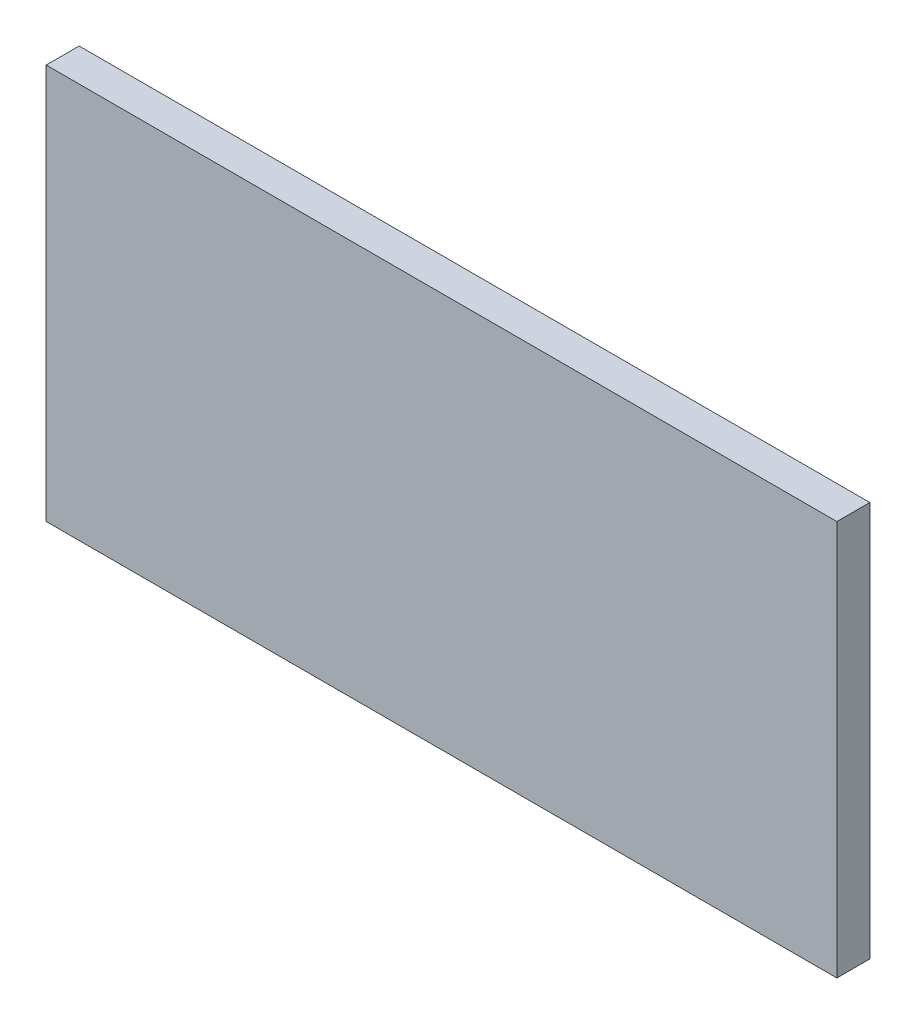
ISO-10303-21;
HEADER;
FILE_DESCRIPTION(('STEP AP214'),'2;1');
FILE_NAME('part.step','',(''),(''),'','','');
FILE_SCHEMA(('AUTOMOTIVE_DESIGN { 1 0 10303 214 1 1 1 1 }'));
ENDSEC;
DATA;
#1=APPLICATION_CONTEXT('core data for automotive mechanical design processes');
#2=APPLICATION_PROTOCOL_DEFINITION('international standard','automotive_design',2000,#1);
#3=PRODUCT_CONTEXT('',#1,'mechanical');
#4=PRODUCT('Part','Part','',(#3));
#5=PRODUCT_RELATED_PRODUCT_CATEGORY('part','',(#4));
#6=PRODUCT_DEFINITION_FORMATION('','',#4);
#7=PRODUCT_DEFINITION_CONTEXT('part definition',#1,'design');
#8=PRODUCT_DEFINITION('design','',#6,#7);
#9=PRODUCT_DEFINITION_SHAPE('','',#8);
#10=(LENGTH_UNIT() NAMED_UNIT(*) SI_UNIT(.MILLI.,.METRE.));
#11=(NAMED_UNIT(*) PLANE_ANGLE_UNIT() SI_UNIT($,.RADIAN.));
#12=(NAMED_UNIT(*) SI_UNIT($,.STERADIAN.) SOLID_ANGLE_UNIT());
#13=UNCERTAINTY_MEASURE_WITH_UNIT(LENGTH_MEASURE(1.E-05),#10,'distance_accuracy_value','');
#14=(GEOMETRIC_REPRESENTATION_CONTEXT(3) GLOBAL_UNCERTAINTY_ASSIGNED_CONTEXT((#13)) GLOBAL_UNIT_ASSIGNED_CONTEXT((#10,
#11,#12)) REPRESENTATION_CONTEXT('',''));
#15=CARTESIAN_POINT('',(0.,0.,0.));
#16=DIRECTION('',(0.,0.,1.));
#17=DIRECTION('',(1.,0.,0.));
#18=AXIS2_PLACEMENT_3D('',#15,#16,#17);
#19=CARTESIAN_POINT('',(-61.7619783616692,25.6877897990726,5.));
#20=DIRECTION('',(1.,0.,0.));
#21=DIRECTION('',(0.,1.,0.));
#22=AXIS2_PLACEMENT_3D('',#19,#20,#21);
#23=PLANE('',#22);
#24=DIRECTION('',(0.,-1.,0.));
#25=VECTOR('',#24,1.);
#26=CARTESIAN_POINT('',(-61.7619783616692,25.6877897990726,0.));
#27=LINE('',#26,#25);
#28=CARTESIAN_POINT('',(-61.7619783616692,25.6877897990726,0.));
#29=VERTEX_POINT('',#28);
#30=CARTESIAN_POINT('',(-61.7619783616692,-34.3122102009274,0.));
#31=VERTEX_POINT('',#30);
#32=EDGE_CURVE('E113',#29,#31,#27,.T.);
#33=ORIENTED_EDGE('',*,*,#32,.T.);
#34=DIRECTION('',(0.,0.,-1.));
#35=VECTOR('',#34,1.);
#36=CARTESIAN_POINT('',(-61.7619783616692,-34.3122102009274,5.));
#37=LINE('',#36,#35);
#38=CARTESIAN_POINT('',(-61.7619783616692,-34.3122102009274,5.));
#39=VERTEX_POINT('',#38);
#40=EDGE_CURVE('E11',#39,#31,#37,.T.);
#41=ORIENTED_EDGE('',*,*,#40,.F.);
#42=DIRECTION('',(0.,-1.,0.));
#43=VECTOR('',#42,1.);
#44=CARTESIAN_POINT('',(-61.7619783616692,25.6877897990726,5.));
#45=LINE('',#44,#43);
#46=CARTESIAN_POINT('',(-61.7619783616692,25.6877897990726,5.));
#47=VERTEX_POINT('',#46);
#48=EDGE_CURVE('E97',#47,#39,#45,.T.);
#49=ORIENTED_EDGE('',*,*,#48,.F.);
#50=DIRECTION('',(0.,0.,-1.));
#51=VECTOR('',#50,1.);
#52=CARTESIAN_POINT('',(-61.7619783616692,25.6877897990726,5.));
#53=LINE('',#52,#51);
#54=EDGE_CURVE('E109',#47,#29,#53,.T.);
#55=ORIENTED_EDGE('',*,*,#54,.T.);
#56=EDGE_LOOP('',(#33,#41,#49,#55));
#57=FACE_BOUND('',#56,.T.);
#58=ADVANCED_FACE('F45',(#57),#23,.F.);
#59=CARTESIAN_POINT('',(-61.7619783616692,-34.3122102009274,5.));
#60=DIRECTION('',(0.,1.,0.));
#61=DIRECTION('',(0.,0.,1.));
#62=AXIS2_PLACEMENT_3D('',#59,#60,#61);
#63=PLANE('',#62);
#64=DIRECTION('',(1.,0.,0.));
#65=VECTOR('',#64,1.);
#66=CARTESIAN_POINT('',(-61.7619783616692,-34.3122102009274,0.));
#67=LINE('',#66,#65);
#68=CARTESIAN_POINT('',(58.2380216383308,-34.3122102009274,0.));
#69=VERTEX_POINT('',#68);
#70=EDGE_CURVE('E102',#31,#69,#67,.T.);
#71=ORIENTED_EDGE('',*,*,#70,.T.);
#72=DIRECTION('',(0.,0.,-1.));
#73=VECTOR('',#72,1.);
#74=CARTESIAN_POINT('',(58.2380216383308,-34.3122102009274,5.));
#75=LINE('',#74,#73);
#76=CARTESIAN_POINT('',(58.2380216383308,-34.3122102009274,5.));
#77=VERTEX_POINT('',#76);
#78=EDGE_CURVE('E54',#77,#69,#75,.T.);
#79=ORIENTED_EDGE('',*,*,#78,.F.);
#80=DIRECTION('',(1.,0.,0.));
#81=VECTOR('',#80,1.);
#82=CARTESIAN_POINT('',(-61.7619783616692,-34.3122102009274,5.));
#83=LINE('',#82,#81);
#84=EDGE_CURVE('E92',#39,#77,#83,.T.);
#85=ORIENTED_EDGE('',*,*,#84,.F.);
#86=ORIENTED_EDGE('',*,*,#40,.T.);
#87=EDGE_LOOP('',(#71,#79,#85,#86));
#88=FACE_BOUND('',#87,.T.);
#89=ADVANCED_FACE('F101',(#88),#63,.F.);
#90=CARTESIAN_POINT('',(58.2380216383308,25.6877897990726,5.));
#91=DIRECTION('',(-1.,0.,0.));
#92=DIRECTION('',(0.,-1.,0.));
#93=AXIS2_PLACEMENT_3D('',#90,#91,#92);
#94=PLANE('',#93);
#95=DIRECTION('',(0.,1.,0.));
#96=VECTOR('',#95,1.);
#97=CARTESIAN_POINT('',(58.2380216383308,25.6877897990726,0.));
#98=LINE('',#97,#96);
#99=CARTESIAN_POINT('',(58.2380216383308,25.6877897990726,0.));
#100=VERTEX_POINT('',#99);
#101=EDGE_CURVE('E79',#69,#100,#98,.T.);
#102=ORIENTED_EDGE('',*,*,#101,.T.);
#103=DIRECTION('',(0.,0.,-1.));
#104=VECTOR('',#103,1.);
#105=CARTESIAN_POINT('',(58.2380216383308,25.6877897990726,5.));
#106=LINE('',#105,#104);
#107=CARTESIAN_POINT('',(58.2380216383308,25.6877897990726,5.));
#108=VERTEX_POINT('',#107);
#109=EDGE_CURVE('E104',#108,#100,#106,.T.);
#110=ORIENTED_EDGE('',*,*,#109,.F.);
#111=DIRECTION('',(0.,1.,0.));
#112=VECTOR('',#111,1.);
#113=CARTESIAN_POINT('',(58.2380216383308,25.6877897990726,5.));
#114=LINE('',#113,#112);
#115=EDGE_CURVE('E95',#77,#108,#114,.T.);
#116=ORIENTED_EDGE('',*,*,#115,.F.);
#117=ORIENTED_EDGE('',*,*,#78,.T.);
#118=EDGE_LOOP('',(#102,#110,#116,#117));
#119=FACE_BOUND('',#118,.T.);
#120=ADVANCED_FACE('F105',(#119),#94,.F.);
#121=CARTESIAN_POINT('',(-61.7619783616692,25.6877897990726,5.));
#122=DIRECTION('',(0.,-1.,0.));
#123=DIRECTION('',(0.,0.,-1.));
#124=AXIS2_PLACEMENT_3D('',#121,#122,#123);
#125=PLANE('',#124);
#126=DIRECTION('',(-1.,0.,0.));
#127=VECTOR('',#126,1.);
#128=CARTESIAN_POINT('',(-61.7619783616692,25.6877897990726,0.));
#129=LINE('',#128,#127);
#130=EDGE_CURVE('E85',#100,#29,#129,.T.);
#131=ORIENTED_EDGE('',*,*,#130,.T.);
#132=ORIENTED_EDGE('',*,*,#54,.F.);
#133=DIRECTION('',(-1.,0.,0.));
#134=VECTOR('',#133,1.);
#135=CARTESIAN_POINT('',(-61.7619783616692,25.6877897990726,5.));
#136=LINE('',#135,#134);
#137=EDGE_CURVE('E62',#108,#47,#136,.T.);
#138=ORIENTED_EDGE('',*,*,#137,.F.);
#139=ORIENTED_EDGE('',*,*,#109,.T.);
#140=EDGE_LOOP('',(#131,#132,#138,#139));
#141=FACE_BOUND('',#140,.T.);
#142=ADVANCED_FACE('F126',(#141),#125,.F.);
#143=CARTESIAN_POINT('',(0.,0.,5.));
#144=DIRECTION('',(0.,0.,1.));
#145=DIRECTION('',(1.,0.,0.));
#146=AXIS2_PLACEMENT_3D('',#143,#144,#145);
#147=PLANE('',#146);
#148=ORIENTED_EDGE('',*,*,#48,.T.);
#149=ORIENTED_EDGE('',*,*,#84,.T.);
#150=ORIENTED_EDGE('',*,*,#115,.T.);
#151=ORIENTED_EDGE('',*,*,#137,.T.);
#152=EDGE_LOOP('',(#148,#149,#150,#151));
#153=FACE_BOUND('',#152,.T.);
#154=ADVANCED_FACE('F93',(#153),#147,.T.);
#155=CARTESIAN_POINT('',(0.,0.,0.));
#156=DIRECTION('',(0.,0.,1.));
#157=DIRECTION('',(1.,0.,0.));
#158=AXIS2_PLACEMENT_3D('',#155,#156,#157);
#159=PLANE('',#158);
#160=ORIENTED_EDGE('',*,*,#32,.F.);
#161=ORIENTED_EDGE('',*,*,#130,.F.);
#162=ORIENTED_EDGE('',*,*,#101,.F.);
#163=ORIENTED_EDGE('',*,*,#70,.F.);
#164=EDGE_LOOP('',(#160,#161,#162,#163));
#165=FACE_BOUND('',#164,.T.);
#166=ADVANCED_FACE('F129',(#165),#159,.F.);
#167=CLOSED_SHELL('',(#58,#89,#120,#142,#154,#166));
#168=MANIFOLD_SOLID_BREP('B2',#167);
#169=ADVANCED_BREP_SHAPE_REPRESENTATION('',(#18,#168),#14);
#170=SHAPE_DEFINITION_REPRESENTATION(#9,#169);
ENDSEC;
END-ISO-10303-21;
